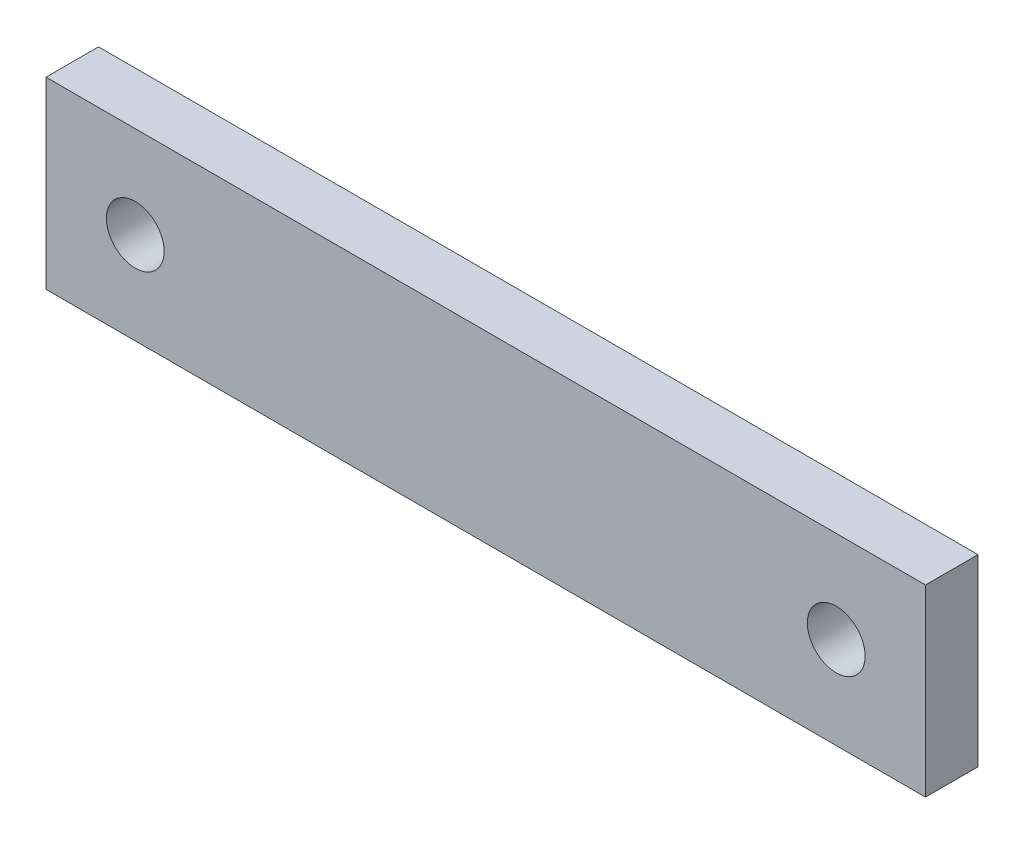
ISO-10303-21;
HEADER;
FILE_DESCRIPTION(('STEP AP214'),'2;1');
FILE_NAME('part.step','',(''),(''),'','','');
FILE_SCHEMA(('AUTOMOTIVE_DESIGN { 1 0 10303 214 1 1 1 1 }'));
ENDSEC;
DATA;
#1=APPLICATION_CONTEXT('core data for automotive mechanical design processes');
#2=APPLICATION_PROTOCOL_DEFINITION('international standard','automotive_design',2000,#1);
#3=PRODUCT_CONTEXT('',#1,'mechanical');
#4=PRODUCT('Part','Part','',(#3));
#5=PRODUCT_RELATED_PRODUCT_CATEGORY('part','',(#4));
#6=PRODUCT_DEFINITION_FORMATION('','',#4);
#7=PRODUCT_DEFINITION_CONTEXT('part definition',#1,'design');
#8=PRODUCT_DEFINITION('design','',#6,#7);
#9=PRODUCT_DEFINITION_SHAPE('','',#8);
#10=(LENGTH_UNIT() NAMED_UNIT(*) SI_UNIT(.MILLI.,.METRE.));
#11=(NAMED_UNIT(*) PLANE_ANGLE_UNIT() SI_UNIT($,.RADIAN.));
#12=(NAMED_UNIT(*) SI_UNIT($,.STERADIAN.) SOLID_ANGLE_UNIT());
#13=UNCERTAINTY_MEASURE_WITH_UNIT(LENGTH_MEASURE(1.E-05),#10,'distance_accuracy_value','');
#14=(GEOMETRIC_REPRESENTATION_CONTEXT(3) GLOBAL_UNCERTAINTY_ASSIGNED_CONTEXT((#13)) GLOBAL_UNIT_ASSIGNED_CONTEXT((#10,
#11,#12)) REPRESENTATION_CONTEXT('',''));
#15=CARTESIAN_POINT('',(0.,0.,0.));
#16=DIRECTION('',(0.,0.,1.));
#17=DIRECTION('',(1.,0.,0.));
#18=AXIS2_PLACEMENT_3D('',#15,#16,#17);
#19=CARTESIAN_POINT('',(0.,0.,20.));
#20=DIRECTION('',(1.,0.,0.));
#21=DIRECTION('',(0.,0.,-1.));
#22=AXIS2_PLACEMENT_3D('',#19,#20,#21);
#23=PLANE('',#22);
#24=DIRECTION('',(0.,-1.,0.));
#25=VECTOR('',#24,1.);
#26=CARTESIAN_POINT('',(0.,0.,0.));
#27=LINE('',#26,#25);
#28=CARTESIAN_POINT('',(0.,70.,0.));
#29=VERTEX_POINT('',#28);
#30=CARTESIAN_POINT('',(0.,0.,0.));
#31=VERTEX_POINT('',#30);
#32=EDGE_CURVE('E97',#29,#31,#27,.T.);
#33=ORIENTED_EDGE('',*,*,#32,.T.);
#34=DIRECTION('',(0.,0.,-1.));
#35=VECTOR('',#34,1.);
#36=CARTESIAN_POINT('',(0.,0.,20.));
#37=LINE('',#36,#35);
#38=CARTESIAN_POINT('',(0.,0.,20.));
#39=VERTEX_POINT('',#38);
#40=EDGE_CURVE('E11',#39,#31,#37,.T.);
#41=ORIENTED_EDGE('',*,*,#40,.F.);
#42=DIRECTION('',(0.,-1.,0.));
#43=VECTOR('',#42,1.);
#44=CARTESIAN_POINT('',(0.,0.,20.));
#45=LINE('',#44,#43);
#46=CARTESIAN_POINT('',(0.,70.,20.));
#47=VERTEX_POINT('',#46);
#48=EDGE_CURVE('E85',#47,#39,#45,.T.);
#49=ORIENTED_EDGE('',*,*,#48,.F.);
#50=DIRECTION('',(0.,0.,-1.));
#51=VECTOR('',#50,1.);
#52=CARTESIAN_POINT('',(0.,70.,20.));
#53=LINE('',#52,#51);
#54=EDGE_CURVE('E93',#47,#29,#53,.T.);
#55=ORIENTED_EDGE('',*,*,#54,.T.);
#56=EDGE_LOOP('',(#33,#41,#49,#55));
#57=FACE_BOUND('',#56,.T.);
#58=ADVANCED_FACE('F34',(#57),#23,.F.);
#59=CARTESIAN_POINT('',(0.,0.,20.));
#60=DIRECTION('',(0.,1.,0.));
#61=DIRECTION('',(0.,0.,1.));
#62=AXIS2_PLACEMENT_3D('',#59,#60,#61);
#63=PLANE('',#62);
#64=DIRECTION('',(1.,0.,0.));
#65=VECTOR('',#64,1.);
#66=CARTESIAN_POINT('',(0.,0.,0.));
#67=LINE('',#66,#65);
#68=CARTESIAN_POINT('',(335.,0.,0.));
#69=VERTEX_POINT('',#68);
#70=EDGE_CURVE('E89',#31,#69,#67,.T.);
#71=ORIENTED_EDGE('',*,*,#70,.T.);
#72=DIRECTION('',(0.,0.,-1.));
#73=VECTOR('',#72,1.);
#74=CARTESIAN_POINT('',(335.,0.,20.));
#75=LINE('',#74,#73);
#76=CARTESIAN_POINT('',(335.,0.,20.));
#77=VERTEX_POINT('',#76);
#78=EDGE_CURVE('E42',#77,#69,#75,.T.);
#79=ORIENTED_EDGE('',*,*,#78,.F.);
#80=DIRECTION('',(1.,0.,0.));
#81=VECTOR('',#80,1.);
#82=CARTESIAN_POINT('',(0.,0.,20.));
#83=LINE('',#82,#81);
#84=EDGE_CURVE('E80',#39,#77,#83,.T.);
#85=ORIENTED_EDGE('',*,*,#84,.F.);
#86=ORIENTED_EDGE('',*,*,#40,.T.);
#87=EDGE_LOOP('',(#71,#79,#85,#86));
#88=FACE_BOUND('',#87,.T.);
#89=ADVANCED_FACE('F88',(#88),#63,.F.);
#90=CARTESIAN_POINT('',(335.,0.,20.));
#91=DIRECTION('',(-1.,0.,0.));
#92=DIRECTION('',(0.,0.,1.));
#93=AXIS2_PLACEMENT_3D('',#90,#91,#92);
#94=PLANE('',#93);
#95=DIRECTION('',(0.,1.,0.));
#96=VECTOR('',#95,1.);
#97=CARTESIAN_POINT('',(335.,0.,0.));
#98=LINE('',#97,#96);
#99=CARTESIAN_POINT('',(335.,70.,0.));
#100=VERTEX_POINT('',#99);
#101=EDGE_CURVE('E67',#69,#100,#98,.T.);
#102=ORIENTED_EDGE('',*,*,#101,.T.);
#103=DIRECTION('',(0.,0.,-1.));
#104=VECTOR('',#103,1.);
#105=CARTESIAN_POINT('',(335.,70.,20.));
#106=LINE('',#105,#104);
#107=CARTESIAN_POINT('',(335.,70.,20.));
#108=VERTEX_POINT('',#107);
#109=EDGE_CURVE('E90',#108,#100,#106,.T.);
#110=ORIENTED_EDGE('',*,*,#109,.F.);
#111=DIRECTION('',(0.,1.,0.));
#112=VECTOR('',#111,1.);
#113=CARTESIAN_POINT('',(335.,0.,20.));
#114=LINE('',#113,#112);
#115=EDGE_CURVE('E83',#77,#108,#114,.T.);
#116=ORIENTED_EDGE('',*,*,#115,.F.);
#117=ORIENTED_EDGE('',*,*,#78,.T.);
#118=EDGE_LOOP('',(#102,#110,#116,#117));
#119=FACE_BOUND('',#118,.T.);
#120=ADVANCED_FACE('F91',(#119),#94,.F.);
#121=CARTESIAN_POINT('',(0.,70.,20.));
#122=DIRECTION('',(0.,-1.,0.));
#123=DIRECTION('',(0.,0.,-1.));
#124=AXIS2_PLACEMENT_3D('',#121,#122,#123);
#125=PLANE('',#124);
#126=DIRECTION('',(-1.,0.,0.));
#127=VECTOR('',#126,1.);
#128=CARTESIAN_POINT('',(0.,70.,0.));
#129=LINE('',#128,#127);
#130=EDGE_CURVE('E73',#100,#29,#129,.T.);
#131=ORIENTED_EDGE('',*,*,#130,.T.);
#132=ORIENTED_EDGE('',*,*,#54,.F.);
#133=DIRECTION('',(-1.,0.,0.));
#134=VECTOR('',#133,1.);
#135=CARTESIAN_POINT('',(0.,70.,20.));
#136=LINE('',#135,#134);
#137=EDGE_CURVE('E50',#108,#47,#136,.T.);
#138=ORIENTED_EDGE('',*,*,#137,.F.);
#139=ORIENTED_EDGE('',*,*,#109,.T.);
#140=EDGE_LOOP('',(#131,#132,#138,#139));
#141=FACE_BOUND('',#140,.T.);
#142=ADVANCED_FACE('F105',(#141),#125,.F.);
#143=CARTESIAN_POINT('',(0.,0.,20.));
#144=DIRECTION('',(0.,0.,-1.));
#145=DIRECTION('',(-1.,0.,0.));
#146=AXIS2_PLACEMENT_3D('',#143,#144,#145);
#147=PLANE('',#146);
#148=CARTESIAN_POINT('',(301.,35.,20.));
#149=DIRECTION('',(0.,0.,1.));
#150=DIRECTION('',(1.,0.,0.));
#151=AXIS2_PLACEMENT_3D('',#148,#149,#150);
#152=CIRCLE('',#151,11.);
#153=CARTESIAN_POINT('',(312.,35.,20.));
#154=VERTEX_POINT('',#153);
#155=EDGE_CURVE('E117',#154,#154,#152,.T.);
#156=ORIENTED_EDGE('',*,*,#155,.F.);
#157=EDGE_LOOP('',(#156));
#158=FACE_BOUND('',#157,.T.);
#159=CARTESIAN_POINT('',(34.,35.,20.));
#160=DIRECTION('',(0.,0.,1.));
#161=DIRECTION('',(1.,0.,0.));
#162=AXIS2_PLACEMENT_3D('',#159,#160,#161);
#163=CIRCLE('',#162,11.);
#164=CARTESIAN_POINT('',(45.,35.,20.));
#165=VERTEX_POINT('',#164);
#166=EDGE_CURVE('E111',#165,#165,#163,.T.);
#167=ORIENTED_EDGE('',*,*,#166,.F.);
#168=EDGE_LOOP('',(#167));
#169=FACE_BOUND('',#168,.T.);
#170=ORIENTED_EDGE('',*,*,#48,.T.);
#171=ORIENTED_EDGE('',*,*,#84,.T.);
#172=ORIENTED_EDGE('',*,*,#115,.T.);
#173=ORIENTED_EDGE('',*,*,#137,.T.);
#174=EDGE_LOOP('',(#170,#171,#172,#173));
#175=FACE_BOUND('',#174,.T.);
#176=ADVANCED_FACE('F81',(#158,#169,#175),#147,.F.);
#177=CARTESIAN_POINT('',(0.,0.,0.));
#178=DIRECTION('',(0.,0.,-1.));
#179=DIRECTION('',(-1.,0.,0.));
#180=AXIS2_PLACEMENT_3D('',#177,#178,#179);
#181=PLANE('',#180);
#182=CARTESIAN_POINT('',(301.,35.,0.));
#183=DIRECTION('',(0.,0.,1.));
#184=DIRECTION('',(1.,0.,0.));
#185=AXIS2_PLACEMENT_3D('',#182,#183,#184);
#186=CIRCLE('',#185,11.);
#187=CARTESIAN_POINT('',(312.,35.,0.));
#188=VERTEX_POINT('',#187);
#189=EDGE_CURVE('E114',#188,#188,#186,.T.);
#190=ORIENTED_EDGE('',*,*,#189,.T.);
#191=EDGE_LOOP('',(#190));
#192=FACE_BOUND('',#191,.T.);
#193=CARTESIAN_POINT('',(34.,35.,0.));
#194=DIRECTION('',(0.,0.,1.));
#195=DIRECTION('',(1.,0.,0.));
#196=AXIS2_PLACEMENT_3D('',#193,#194,#195);
#197=CIRCLE('',#196,11.);
#198=CARTESIAN_POINT('',(45.,35.,0.));
#199=VERTEX_POINT('',#198);
#200=EDGE_CURVE('E100',#199,#199,#197,.T.);
#201=ORIENTED_EDGE('',*,*,#200,.T.);
#202=EDGE_LOOP('',(#201));
#203=FACE_BOUND('',#202,.T.);
#204=ORIENTED_EDGE('',*,*,#32,.F.);
#205=ORIENTED_EDGE('',*,*,#130,.F.);
#206=ORIENTED_EDGE('',*,*,#101,.F.);
#207=ORIENTED_EDGE('',*,*,#70,.F.);
#208=EDGE_LOOP('',(#204,#205,#206,#207));
#209=FACE_BOUND('',#208,.T.);
#210=ADVANCED_FACE('F108',(#192,#203,#209),#181,.T.);
#211=CARTESIAN_POINT('',(34.,35.,0.));
#212=DIRECTION('',(0.,0.,1.));
#213=DIRECTION('',(1.,0.,0.));
#214=AXIS2_PLACEMENT_3D('',#211,#212,#213);
#215=CYLINDRICAL_SURFACE('',#214,11.);
#216=ORIENTED_EDGE('',*,*,#200,.F.);
#217=EDGE_LOOP('',(#216));
#218=FACE_BOUND('',#217,.T.);
#219=ORIENTED_EDGE('',*,*,#166,.T.);
#220=EDGE_LOOP('',(#219));
#221=FACE_BOUND('',#220,.T.);
#222=ADVANCED_FACE('F128',(#218,#221),#215,.F.);
#223=CARTESIAN_POINT('',(301.,35.,0.));
#224=DIRECTION('',(0.,0.,1.));
#225=DIRECTION('',(1.,0.,0.));
#226=AXIS2_PLACEMENT_3D('',#223,#224,#225);
#227=CYLINDRICAL_SURFACE('',#226,11.);
#228=ORIENTED_EDGE('',*,*,#189,.F.);
#229=EDGE_LOOP('',(#228));
#230=FACE_BOUND('',#229,.T.);
#231=ORIENTED_EDGE('',*,*,#155,.T.);
#232=EDGE_LOOP('',(#231));
#233=FACE_BOUND('',#232,.T.);
#234=ADVANCED_FACE('F125',(#230,#233),#227,.F.);
#235=CLOSED_SHELL('',(#58,#89,#120,#142,#176,#210,#222,#234));
#236=MANIFOLD_SOLID_BREP('B2',#235);
#237=ADVANCED_BREP_SHAPE_REPRESENTATION('',(#18,#236),#14);
#238=SHAPE_DEFINITION_REPRESENTATION(#9,#237);
ENDSEC;
END-ISO-10303-21;
